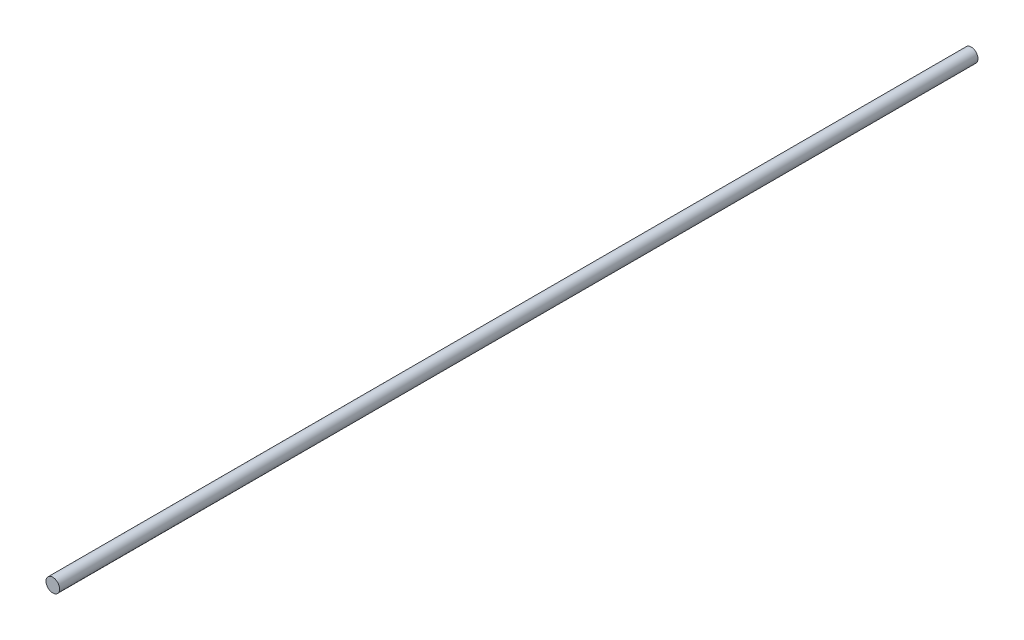
ISO-10303-21;
HEADER;
FILE_DESCRIPTION(('STEP AP214'),'2;1');
FILE_NAME('part.step','',(''),(''),'','','');
FILE_SCHEMA(('AUTOMOTIVE_DESIGN { 1 0 10303 214 1 1 1 1 }'));
ENDSEC;
DATA;
#1=APPLICATION_CONTEXT('core data for automotive mechanical design processes');
#2=APPLICATION_PROTOCOL_DEFINITION('international standard','automotive_design',2000,#1);
#3=PRODUCT_CONTEXT('',#1,'mechanical');
#4=PRODUCT('Part','Part','',(#3));
#5=PRODUCT_RELATED_PRODUCT_CATEGORY('part','',(#4));
#6=PRODUCT_DEFINITION_FORMATION('','',#4);
#7=PRODUCT_DEFINITION_CONTEXT('part definition',#1,'design');
#8=PRODUCT_DEFINITION('design','',#6,#7);
#9=PRODUCT_DEFINITION_SHAPE('','',#8);
#10=(LENGTH_UNIT() NAMED_UNIT(*) SI_UNIT(.MILLI.,.METRE.));
#11=(NAMED_UNIT(*) PLANE_ANGLE_UNIT() SI_UNIT($,.RADIAN.));
#12=(NAMED_UNIT(*) SI_UNIT($,.STERADIAN.) SOLID_ANGLE_UNIT());
#13=UNCERTAINTY_MEASURE_WITH_UNIT(LENGTH_MEASURE(1.E-05),#10,'distance_accuracy_value','');
#14=(GEOMETRIC_REPRESENTATION_CONTEXT(3) GLOBAL_UNCERTAINTY_ASSIGNED_CONTEXT((#13)) GLOBAL_UNIT_ASSIGNED_CONTEXT((#10,
#11,#12)) REPRESENTATION_CONTEXT('',''));
#15=CARTESIAN_POINT('',(0.,0.,0.));
#16=DIRECTION('',(0.,0.,1.));
#17=DIRECTION('',(1.,0.,0.));
#18=AXIS2_PLACEMENT_3D('',#15,#16,#17);
#19=CARTESIAN_POINT('',(0.,0.,135.));
#20=DIRECTION('',(0.,0.,-1.));
#21=DIRECTION('',(-1.,0.,0.));
#22=AXIS2_PLACEMENT_3D('',#19,#20,#21);
#23=CYLINDRICAL_SURFACE('',#22,1.);
#24=CARTESIAN_POINT('',(0.,0.,135.));
#25=DIRECTION('',(0.,0.,1.));
#26=DIRECTION('',(1.,0.,0.));
#27=AXIS2_PLACEMENT_3D('',#24,#25,#26);
#28=CIRCLE('',#27,1.);
#29=CARTESIAN_POINT('',(1.,0.,135.));
#30=VERTEX_POINT('',#29);
#31=EDGE_CURVE('E10',#30,#30,#28,.T.);
#32=ORIENTED_EDGE('',*,*,#31,.F.);
#33=EDGE_LOOP('',(#32));
#34=FACE_BOUND('',#33,.T.);
#35=CARTESIAN_POINT('',(0.,0.,0.));
#36=DIRECTION('',(0.,0.,1.));
#37=DIRECTION('',(1.,0.,0.));
#38=AXIS2_PLACEMENT_3D('',#35,#36,#37);
#39=CIRCLE('',#38,1.);
#40=CARTESIAN_POINT('',(1.,0.,0.));
#41=VERTEX_POINT('',#40);
#42=EDGE_CURVE('E38',#41,#41,#39,.T.);
#43=ORIENTED_EDGE('',*,*,#42,.T.);
#44=EDGE_LOOP('',(#43));
#45=FACE_BOUND('',#44,.T.);
#46=ADVANCED_FACE('F35',(#34,#45),#23,.T.);
#47=CARTESIAN_POINT('',(0.,0.,135.));
#48=DIRECTION('',(0.,0.,1.));
#49=DIRECTION('',(1.,0.,0.));
#50=AXIS2_PLACEMENT_3D('',#47,#48,#49);
#51=PLANE('',#50);
#52=ORIENTED_EDGE('',*,*,#31,.T.);
#53=EDGE_LOOP('',(#52));
#54=FACE_BOUND('',#53,.T.);
#55=ADVANCED_FACE('F50',(#54),#51,.T.);
#56=CARTESIAN_POINT('',(0.,0.,0.));
#57=DIRECTION('',(0.,0.,1.));
#58=DIRECTION('',(1.,0.,0.));
#59=AXIS2_PLACEMENT_3D('',#56,#57,#58);
#60=PLANE('',#59);
#61=ORIENTED_EDGE('',*,*,#42,.F.);
#62=EDGE_LOOP('',(#61));
#63=FACE_BOUND('',#62,.T.);
#64=ADVANCED_FACE('F48',(#63),#60,.F.);
#65=CLOSED_SHELL('',(#46,#55,#64));
#66=MANIFOLD_SOLID_BREP('B2',#65);
#67=ADVANCED_BREP_SHAPE_REPRESENTATION('',(#18,#66),#14);
#68=SHAPE_DEFINITION_REPRESENTATION(#9,#67);
ENDSEC;
END-ISO-10303-21;
